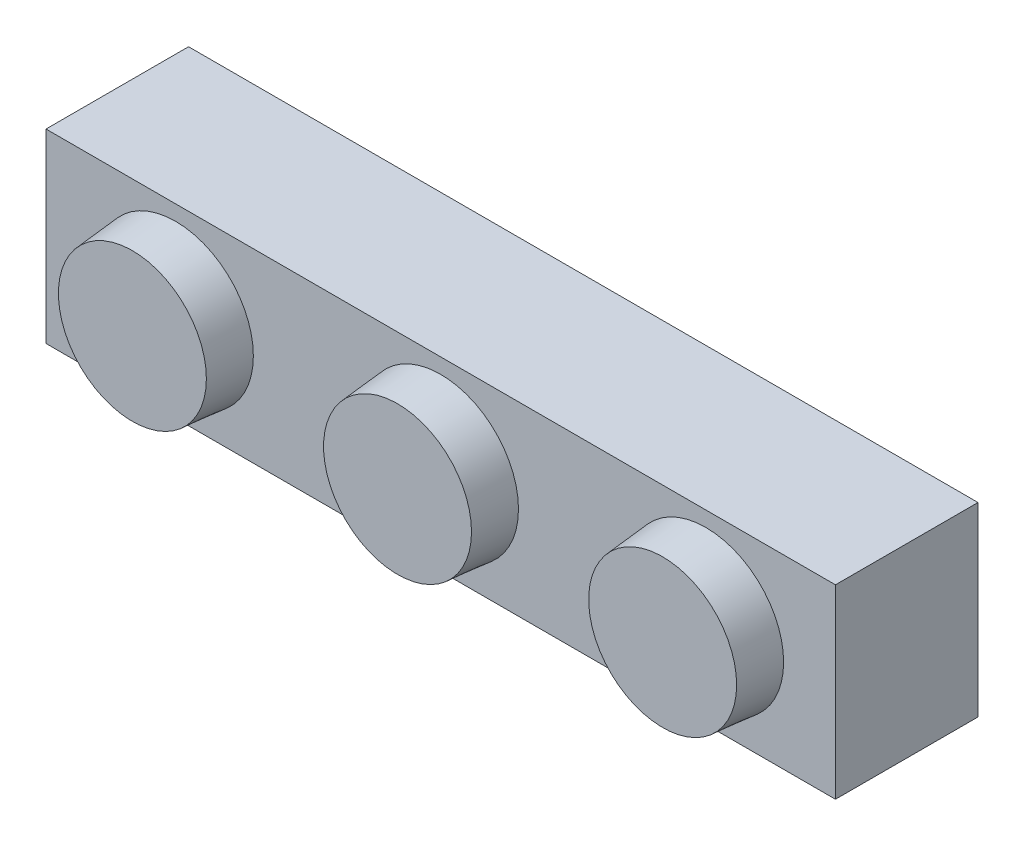
ISO-10303-21;
HEADER;
FILE_DESCRIPTION(('STEP AP214'),'2;1');
FILE_NAME('part.step','',(''),(''),'','','');
FILE_SCHEMA(('AUTOMOTIVE_DESIGN { 1 0 10303 214 1 1 1 1 }'));
ENDSEC;
DATA;
#1=APPLICATION_CONTEXT('core data for automotive mechanical design processes');
#2=APPLICATION_PROTOCOL_DEFINITION('international standard','automotive_design',2000,#1);
#3=PRODUCT_CONTEXT('',#1,'mechanical');
#4=PRODUCT('Part','Part','',(#3));
#5=PRODUCT_RELATED_PRODUCT_CATEGORY('part','',(#4));
#6=PRODUCT_DEFINITION_FORMATION('','',#4);
#7=PRODUCT_DEFINITION_CONTEXT('part definition',#1,'design');
#8=PRODUCT_DEFINITION('design','',#6,#7);
#9=PRODUCT_DEFINITION_SHAPE('','',#8);
#10=(LENGTH_UNIT() NAMED_UNIT(*) SI_UNIT(.MILLI.,.METRE.));
#11=(NAMED_UNIT(*) PLANE_ANGLE_UNIT() SI_UNIT($,.RADIAN.));
#12=(NAMED_UNIT(*) SI_UNIT($,.STERADIAN.) SOLID_ANGLE_UNIT());
#13=UNCERTAINTY_MEASURE_WITH_UNIT(LENGTH_MEASURE(1.E-05),#10,'distance_accuracy_value','');
#14=(GEOMETRIC_REPRESENTATION_CONTEXT(3) GLOBAL_UNCERTAINTY_ASSIGNED_CONTEXT((#13)) GLOBAL_UNIT_ASSIGNED_CONTEXT((#10,
#11,#12)) REPRESENTATION_CONTEXT('',''));
#15=CARTESIAN_POINT('',(0.,0.,0.));
#16=DIRECTION('',(0.,0.,1.));
#17=DIRECTION('',(1.,0.,0.));
#18=AXIS2_PLACEMENT_3D('',#15,#16,#17);
#19=CARTESIAN_POINT('',(1160.4625,546.1,-209.55));
#20=DIRECTION('',(-1.,0.,0.));
#21=DIRECTION('',(0.,0.,1.));
#22=AXIS2_PLACEMENT_3D('',#19,#20,#21);
#23=PLANE('',#22);
#24=DIRECTION('',(0.,0.,-1.));
#25=VECTOR('',#24,1.);
#26=CARTESIAN_POINT('',(1160.4625,0.,-209.55));
#27=LINE('',#26,#25);
#28=CARTESIAN_POINT('',(1160.4625,0.,209.55));
#29=VERTEX_POINT('',#28);
#30=CARTESIAN_POINT('',(1160.4625,0.,-209.55));
#31=VERTEX_POINT('',#30);
#32=EDGE_CURVE('E113',#29,#31,#27,.T.);
#33=ORIENTED_EDGE('',*,*,#32,.T.);
#34=DIRECTION('',(0.,-1.,0.));
#35=VECTOR('',#34,1.);
#36=CARTESIAN_POINT('',(1160.4625,546.1,-209.55));
#37=LINE('',#36,#35);
#38=CARTESIAN_POINT('',(1160.4625,546.1,-209.55));
#39=VERTEX_POINT('',#38);
#40=EDGE_CURVE('E102',#39,#31,#37,.T.);
#41=ORIENTED_EDGE('',*,*,#40,.F.);
#42=DIRECTION('',(0.,0.,-1.));
#43=VECTOR('',#42,1.);
#44=CARTESIAN_POINT('',(1160.4625,546.1,-209.55));
#45=LINE('',#44,#43);
#46=CARTESIAN_POINT('',(1160.4625,546.1,209.55));
#47=VERTEX_POINT('',#46);
#48=EDGE_CURVE('E94',#47,#39,#45,.T.);
#49=ORIENTED_EDGE('',*,*,#48,.F.);
#50=DIRECTION('',(0.,-1.,0.));
#51=VECTOR('',#50,1.);
#52=CARTESIAN_POINT('',(1160.4625,546.1,209.55));
#53=LINE('',#52,#51);
#54=EDGE_CURVE('E109',#47,#29,#53,.T.);
#55=ORIENTED_EDGE('',*,*,#54,.T.);
#56=EDGE_LOOP('',(#33,#41,#49,#55));
#57=FACE_BOUND('',#56,.T.);
#58=ADVANCED_FACE('F41',(#57),#23,.F.);
#59=CARTESIAN_POINT('',(-1160.4625,546.1,-209.55));
#60=DIRECTION('',(0.,0.,1.));
#61=DIRECTION('',(1.,0.,0.));
#62=AXIS2_PLACEMENT_3D('',#59,#60,#61);
#63=PLANE('',#62);
#64=DIRECTION('',(-1.,0.,0.));
#65=VECTOR('',#64,1.);
#66=CARTESIAN_POINT('',(-1160.4625,0.,-209.55));
#67=LINE('',#66,#65);
#68=CARTESIAN_POINT('',(-1160.4625,0.,-209.55));
#69=VERTEX_POINT('',#68);
#70=EDGE_CURVE('E100',#31,#69,#67,.T.);
#71=ORIENTED_EDGE('',*,*,#70,.T.);
#72=DIRECTION('',(0.,-1.,0.));
#73=VECTOR('',#72,1.);
#74=CARTESIAN_POINT('',(-1160.4625,546.1,-209.55));
#75=LINE('',#74,#73);
#76=CARTESIAN_POINT('',(-1160.4625,546.1,-209.55));
#77=VERTEX_POINT('',#76);
#78=EDGE_CURVE('E98',#77,#69,#75,.T.);
#79=ORIENTED_EDGE('',*,*,#78,.F.);
#80=DIRECTION('',(-1.,0.,0.));
#81=VECTOR('',#80,1.);
#82=CARTESIAN_POINT('',(-1160.4625,546.1,-209.55));
#83=LINE('',#82,#81);
#84=EDGE_CURVE('E89',#39,#77,#83,.T.);
#85=ORIENTED_EDGE('',*,*,#84,.F.);
#86=ORIENTED_EDGE('',*,*,#40,.T.);
#87=EDGE_LOOP('',(#71,#79,#85,#86));
#88=FACE_BOUND('',#87,.T.);
#89=ADVANCED_FACE('F99',(#88),#63,.F.);
#90=CARTESIAN_POINT('',(-1160.4625,546.1,-209.55));
#91=DIRECTION('',(1.,0.,0.));
#92=DIRECTION('',(0.,0.,-1.));
#93=AXIS2_PLACEMENT_3D('',#90,#91,#92);
#94=PLANE('',#93);
#95=DIRECTION('',(0.,0.,1.));
#96=VECTOR('',#95,1.);
#97=CARTESIAN_POINT('',(-1160.4625,0.,-209.55));
#98=LINE('',#97,#96);
#99=CARTESIAN_POINT('',(-1160.4625,0.,209.55));
#100=VERTEX_POINT('',#99);
#101=EDGE_CURVE('E75',#69,#100,#98,.T.);
#102=ORIENTED_EDGE('',*,*,#101,.T.);
#103=DIRECTION('',(0.,-1.,0.));
#104=VECTOR('',#103,1.);
#105=CARTESIAN_POINT('',(-1160.4625,546.1,209.55));
#106=LINE('',#105,#104);
#107=CARTESIAN_POINT('',(-1160.4625,546.1,209.55));
#108=VERTEX_POINT('',#107);
#109=EDGE_CURVE('E103',#108,#100,#106,.T.);
#110=ORIENTED_EDGE('',*,*,#109,.F.);
#111=DIRECTION('',(0.,0.,1.));
#112=VECTOR('',#111,1.);
#113=CARTESIAN_POINT('',(-1160.4625,546.1,-209.55));
#114=LINE('',#113,#112);
#115=EDGE_CURVE('E92',#77,#108,#114,.T.);
#116=ORIENTED_EDGE('',*,*,#115,.F.);
#117=ORIENTED_EDGE('',*,*,#78,.T.);
#118=EDGE_LOOP('',(#102,#110,#116,#117));
#119=FACE_BOUND('',#118,.T.);
#120=ADVANCED_FACE('F105',(#119),#94,.F.);
#121=CARTESIAN_POINT('',(-1160.4625,546.1,209.55));
#122=DIRECTION('',(0.,0.,-1.));
#123=DIRECTION('',(-1.,0.,0.));
#124=AXIS2_PLACEMENT_3D('',#121,#122,#123);
#125=PLANE('',#124);
#126=CARTESIAN_POINT('',(-779.4625,273.05,209.55));
#127=DIRECTION('',(0.,0.,-1.));
#128=DIRECTION('',(-1.,0.,0.));
#129=AXIS2_PLACEMENT_3D('',#126,#127,#128);
#130=CIRCLE('',#129,228.6);
#131=CARTESIAN_POINT('',(-1008.0625,273.05,209.55));
#132=VERTEX_POINT('',#131);
#133=EDGE_CURVE('E11',#132,#132,#130,.F.);
#134=ORIENTED_EDGE('',*,*,#133,.F.);
#135=EDGE_LOOP('',(#134));
#136=FACE_BOUND('',#135,.T.);
#137=CARTESIAN_POINT('',(779.4625,273.05,209.55));
#138=DIRECTION('',(0.,0.,-1.));
#139=DIRECTION('',(-1.,0.,0.));
#140=AXIS2_PLACEMENT_3D('',#137,#138,#139);
#141=CIRCLE('',#140,228.6);
#142=CARTESIAN_POINT('',(550.8625,273.05,209.55));
#143=VERTEX_POINT('',#142);
#144=EDGE_CURVE('E50',#143,#143,#141,.F.);
#145=ORIENTED_EDGE('',*,*,#144,.F.);
#146=EDGE_LOOP('',(#145));
#147=FACE_BOUND('',#146,.T.);
#148=CARTESIAN_POINT('',(1.11022302462516E-13,273.05,209.55));
#149=DIRECTION('',(0.,0.,1.));
#150=DIRECTION('',(1.,0.,0.));
#151=AXIS2_PLACEMENT_3D('',#148,#149,#150);
#152=CIRCLE('',#151,228.6);
#153=CARTESIAN_POINT('',(228.6,273.05,209.55));
#154=VERTEX_POINT('',#153);
#155=EDGE_CURVE('E129',#154,#154,#152,.T.);
#156=ORIENTED_EDGE('',*,*,#155,.F.);
#157=EDGE_LOOP('',(#156));
#158=FACE_BOUND('',#157,.T.);
#159=DIRECTION('',(1.,0.,0.));
#160=VECTOR('',#159,1.);
#161=CARTESIAN_POINT('',(-1160.4625,0.,209.55));
#162=LINE('',#161,#160);
#163=EDGE_CURVE('E81',#100,#29,#162,.T.);
#164=ORIENTED_EDGE('',*,*,#163,.T.);
#165=ORIENTED_EDGE('',*,*,#54,.F.);
#166=DIRECTION('',(1.,0.,0.));
#167=VECTOR('',#166,1.);
#168=CARTESIAN_POINT('',(-1160.4625,546.1,209.55));
#169=LINE('',#168,#167);
#170=EDGE_CURVE('E58',#108,#47,#169,.T.);
#171=ORIENTED_EDGE('',*,*,#170,.F.);
#172=ORIENTED_EDGE('',*,*,#109,.T.);
#173=EDGE_LOOP('',(#164,#165,#171,#172));
#174=FACE_BOUND('',#173,.T.);
#175=ADVANCED_FACE('F162',(#136,#147,#158,#174),#125,.F.);
#176=CARTESIAN_POINT('',(0.,546.1,0.));
#177=DIRECTION('',(0.,1.,0.));
#178=DIRECTION('',(0.,0.,1.));
#179=AXIS2_PLACEMENT_3D('',#176,#177,#178);
#180=PLANE('',#179);
#181=ORIENTED_EDGE('',*,*,#48,.T.);
#182=ORIENTED_EDGE('',*,*,#84,.T.);
#183=ORIENTED_EDGE('',*,*,#115,.T.);
#184=ORIENTED_EDGE('',*,*,#170,.T.);
#185=EDGE_LOOP('',(#181,#182,#183,#184));
#186=FACE_BOUND('',#185,.T.);
#187=ADVANCED_FACE('F90',(#186),#180,.T.);
#188=CARTESIAN_POINT('',(0.,0.,0.));
#189=DIRECTION('',(0.,1.,0.));
#190=DIRECTION('',(0.,0.,1.));
#191=AXIS2_PLACEMENT_3D('',#188,#189,#190);
#192=PLANE('',#191);
#193=ORIENTED_EDGE('',*,*,#32,.F.);
#194=ORIENTED_EDGE('',*,*,#163,.F.);
#195=ORIENTED_EDGE('',*,*,#101,.F.);
#196=ORIENTED_EDGE('',*,*,#70,.F.);
#197=EDGE_LOOP('',(#193,#194,#195,#196));
#198=FACE_BOUND('',#197,.T.);
#199=ADVANCED_FACE('F172',(#198),#192,.F.);
#200=CARTESIAN_POINT('',(1.11022302462516E-13,273.05,209.55));
#201=DIRECTION('',(0.,0.,-1.));
#202=DIRECTION('',(1.,0.,0.));
#203=AXIS2_PLACEMENT_3D('',#200,#201,#202);
#204=CONICAL_SURFACE('',#203,228.6,0.0872664625997167);
#205=CARTESIAN_POINT('',(1.11022302462516E-13,273.05,336.55));
#206=DIRECTION('',(0.,0.,1.));
#207=DIRECTION('',(1.,0.,0.));
#208=AXIS2_PLACEMENT_3D('',#205,#206,#207);
#209=CIRCLE('',#208,217.488939732208);
#210=CARTESIAN_POINT('',(217.488939732208,273.05,336.55));
#211=VERTEX_POINT('',#210);
#212=EDGE_CURVE('E117',#211,#211,#209,.T.);
#213=ORIENTED_EDGE('',*,*,#212,.F.);
#214=EDGE_LOOP('',(#213));
#215=FACE_BOUND('',#214,.T.);
#216=ORIENTED_EDGE('',*,*,#155,.T.);
#217=EDGE_LOOP('',(#216));
#218=FACE_BOUND('',#217,.T.);
#219=ADVANCED_FACE('F185',(#215,#218),#204,.T.);
#220=CARTESIAN_POINT('',(1.11022302462516E-13,273.05,336.55));
#221=DIRECTION('',(0.,0.,1.));
#222=DIRECTION('',(1.,0.,0.));
#223=AXIS2_PLACEMENT_3D('',#220,#221,#222);
#224=PLANE('',#223);
#225=ORIENTED_EDGE('',*,*,#212,.T.);
#226=EDGE_LOOP('',(#225));
#227=FACE_BOUND('',#226,.T.);
#228=ADVANCED_FACE('F188',(#227),#224,.T.);
#229=CARTESIAN_POINT('',(779.4625,273.05,209.55));
#230=DIRECTION('',(0.,0.,-1.));
#231=DIRECTION('',(1.,0.,0.));
#232=AXIS2_PLACEMENT_3D('',#229,#230,#231);
#233=CONICAL_SURFACE('',#232,228.6,0.0872664625997167);
#234=CARTESIAN_POINT('',(779.4625,273.05,336.55));
#235=DIRECTION('',(0.,0.,1.));
#236=DIRECTION('',(1.,0.,0.));
#237=AXIS2_PLACEMENT_3D('',#234,#235,#236);
#238=CIRCLE('',#237,217.488939732208);
#239=CARTESIAN_POINT('',(996.951439732207,273.05,336.55));
#240=VERTEX_POINT('',#239);
#241=EDGE_CURVE('E141',#240,#240,#238,.T.);
#242=ORIENTED_EDGE('',*,*,#241,.F.);
#243=EDGE_LOOP('',(#242));
#244=FACE_BOUND('',#243,.T.);
#245=ORIENTED_EDGE('',*,*,#144,.T.);
#246=EDGE_LOOP('',(#245));
#247=FACE_BOUND('',#246,.T.);
#248=ADVANCED_FACE('F194',(#244,#247),#233,.T.);
#249=CARTESIAN_POINT('',(779.4625,273.05,336.55));
#250=DIRECTION('',(0.,0.,1.));
#251=DIRECTION('',(1.,0.,0.));
#252=AXIS2_PLACEMENT_3D('',#249,#250,#251);
#253=PLANE('',#252);
#254=ORIENTED_EDGE('',*,*,#241,.T.);
#255=EDGE_LOOP('',(#254));
#256=FACE_BOUND('',#255,.T.);
#257=ADVANCED_FACE('F158',(#256),#253,.T.);
#258=CARTESIAN_POINT('',(-779.4625,273.05,209.55));
#259=DIRECTION('',(0.,0.,-1.));
#260=DIRECTION('',(1.,0.,0.));
#261=AXIS2_PLACEMENT_3D('',#258,#259,#260);
#262=CONICAL_SURFACE('',#261,228.6,0.0872664625997167);
#263=CARTESIAN_POINT('',(-779.4625,273.05,336.55));
#264=DIRECTION('',(0.,0.,1.));
#265=DIRECTION('',(1.,0.,0.));
#266=AXIS2_PLACEMENT_3D('',#263,#264,#265);
#267=CIRCLE('',#266,217.488939732208);
#268=CARTESIAN_POINT('',(-561.973560267792,273.05,336.55));
#269=VERTEX_POINT('',#268);
#270=EDGE_CURVE('E149',#269,#269,#267,.T.);
#271=ORIENTED_EDGE('',*,*,#270,.F.);
#272=EDGE_LOOP('',(#271));
#273=FACE_BOUND('',#272,.T.);
#274=ORIENTED_EDGE('',*,*,#133,.T.);
#275=EDGE_LOOP('',(#274));
#276=FACE_BOUND('',#275,.T.);
#277=ADVANCED_FACE('F155',(#273,#276),#262,.T.);
#278=CARTESIAN_POINT('',(-779.4625,273.05,336.55));
#279=DIRECTION('',(0.,0.,1.));
#280=DIRECTION('',(1.,0.,0.));
#281=AXIS2_PLACEMENT_3D('',#278,#279,#280);
#282=PLANE('',#281);
#283=ORIENTED_EDGE('',*,*,#270,.T.);
#284=EDGE_LOOP('',(#283));
#285=FACE_BOUND('',#284,.T.);
#286=ADVANCED_FACE('F153',(#285),#282,.T.);
#287=CLOSED_SHELL('',(#58,#89,#120,#175,#187,#199,#219,#228,#248,#257,#277,#286));
#288=MANIFOLD_SOLID_BREP('B2',#287);
#289=ADVANCED_BREP_SHAPE_REPRESENTATION('',(#18,#288),#14);
#290=SHAPE_DEFINITION_REPRESENTATION(#9,#289);
ENDSEC;
END-ISO-10303-21;
